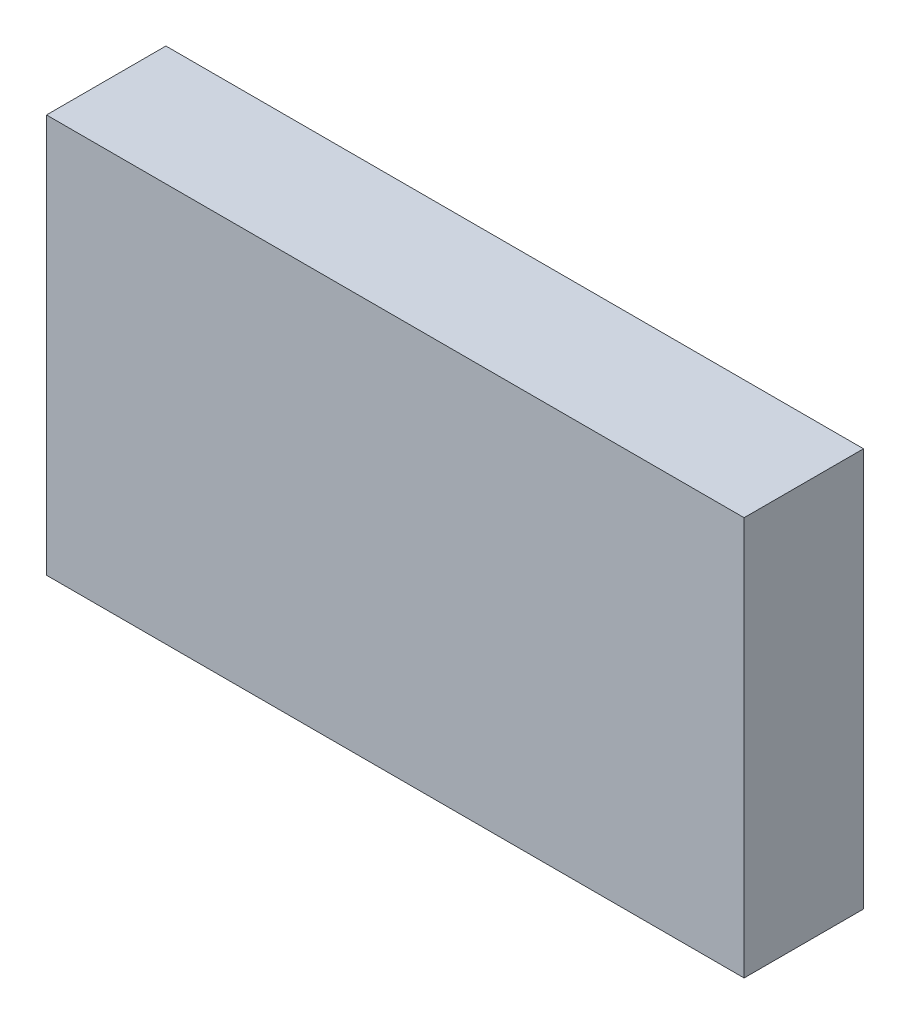
ISO-10303-21;
HEADER;
FILE_DESCRIPTION(('STEP AP214'),'2;1');
FILE_NAME('part.step','',(''),(''),'','','');
FILE_SCHEMA(('AUTOMOTIVE_DESIGN { 1 0 10303 214 1 1 1 1 }'));
ENDSEC;
DATA;
#1=APPLICATION_CONTEXT('core data for automotive mechanical design processes');
#2=APPLICATION_PROTOCOL_DEFINITION('international standard','automotive_design',2000,#1);
#3=PRODUCT_CONTEXT('',#1,'mechanical');
#4=PRODUCT('Part','Part','',(#3));
#5=PRODUCT_RELATED_PRODUCT_CATEGORY('part','',(#4));
#6=PRODUCT_DEFINITION_FORMATION('','',#4);
#7=PRODUCT_DEFINITION_CONTEXT('part definition',#1,'design');
#8=PRODUCT_DEFINITION('design','',#6,#7);
#9=PRODUCT_DEFINITION_SHAPE('','',#8);
#10=(LENGTH_UNIT() NAMED_UNIT(*) SI_UNIT(.MILLI.,.METRE.));
#11=(NAMED_UNIT(*) PLANE_ANGLE_UNIT() SI_UNIT($,.RADIAN.));
#12=(NAMED_UNIT(*) SI_UNIT($,.STERADIAN.) SOLID_ANGLE_UNIT());
#13=UNCERTAINTY_MEASURE_WITH_UNIT(LENGTH_MEASURE(1.E-05),#10,'distance_accuracy_value','');
#14=(GEOMETRIC_REPRESENTATION_CONTEXT(3) GLOBAL_UNCERTAINTY_ASSIGNED_CONTEXT((#13)) GLOBAL_UNIT_ASSIGNED_CONTEXT((#10,
#11,#12)) REPRESENTATION_CONTEXT('',''));
#15=CARTESIAN_POINT('',(0.,0.,0.));
#16=DIRECTION('',(0.,0.,1.));
#17=DIRECTION('',(1.,0.,0.));
#18=AXIS2_PLACEMENT_3D('',#15,#16,#17);
#19=CARTESIAN_POINT('',(29.2109060402685,-16.6919463087248,10.));
#20=DIRECTION('',(-1.,0.,0.));
#21=DIRECTION('',(0.,0.,1.));
#22=AXIS2_PLACEMENT_3D('',#19,#20,#21);
#23=PLANE('',#22);
#24=DIRECTION('',(0.,1.,0.));
#25=VECTOR('',#24,1.);
#26=CARTESIAN_POINT('',(29.2109060402685,-16.6919463087248,0.));
#27=LINE('',#26,#25);
#28=CARTESIAN_POINT('',(29.2109060402685,-16.6919463087248,0.));
#29=VERTEX_POINT('',#28);
#30=CARTESIAN_POINT('',(29.2109060402685,16.6919463087248,0.));
#31=VERTEX_POINT('',#30);
#32=EDGE_CURVE('E100',#29,#31,#27,.T.);
#33=ORIENTED_EDGE('',*,*,#32,.T.);
#34=DIRECTION('',(0.,0.,-1.));
#35=VECTOR('',#34,1.);
#36=CARTESIAN_POINT('',(29.2109060402685,16.6919463087248,10.));
#37=LINE('',#36,#35);
#38=CARTESIAN_POINT('',(29.2109060402685,16.6919463087248,10.));
#39=VERTEX_POINT('',#38);
#40=EDGE_CURVE('E11',#39,#31,#37,.T.);
#41=ORIENTED_EDGE('',*,*,#40,.F.);
#42=DIRECTION('',(0.,1.,0.));
#43=VECTOR('',#42,1.);
#44=CARTESIAN_POINT('',(29.2109060402685,-16.6919463087248,10.));
#45=LINE('',#44,#43);
#46=CARTESIAN_POINT('',(29.2109060402685,-16.6919463087248,10.));
#47=VERTEX_POINT('',#46);
#48=EDGE_CURVE('E88',#47,#39,#45,.T.);
#49=ORIENTED_EDGE('',*,*,#48,.F.);
#50=DIRECTION('',(0.,0.,-1.));
#51=VECTOR('',#50,1.);
#52=CARTESIAN_POINT('',(29.2109060402685,-16.6919463087248,10.));
#53=LINE('',#52,#51);
#54=EDGE_CURVE('E96',#47,#29,#53,.T.);
#55=ORIENTED_EDGE('',*,*,#54,.T.);
#56=EDGE_LOOP('',(#33,#41,#49,#55));
#57=FACE_BOUND('',#56,.T.);
#58=ADVANCED_FACE('F37',(#57),#23,.F.);
#59=CARTESIAN_POINT('',(29.2109060402685,16.6919463087248,10.));
#60=DIRECTION('',(0.,-1.,0.));
#61=DIRECTION('',(0.,0.,-1.));
#62=AXIS2_PLACEMENT_3D('',#59,#60,#61);
#63=PLANE('',#62);
#64=DIRECTION('',(-1.,0.,0.));
#65=VECTOR('',#64,1.);
#66=CARTESIAN_POINT('',(29.2109060402685,16.6919463087248,0.));
#67=LINE('',#66,#65);
#68=CARTESIAN_POINT('',(-29.2109060402685,16.6919463087248,0.));
#69=VERTEX_POINT('',#68);
#70=EDGE_CURVE('E92',#31,#69,#67,.T.);
#71=ORIENTED_EDGE('',*,*,#70,.T.);
#72=DIRECTION('',(0.,0.,-1.));
#73=VECTOR('',#72,1.);
#74=CARTESIAN_POINT('',(-29.2109060402685,16.6919463087248,10.));
#75=LINE('',#74,#73);
#76=CARTESIAN_POINT('',(-29.2109060402685,16.6919463087248,10.));
#77=VERTEX_POINT('',#76);
#78=EDGE_CURVE('E45',#77,#69,#75,.T.);
#79=ORIENTED_EDGE('',*,*,#78,.F.);
#80=DIRECTION('',(-1.,0.,0.));
#81=VECTOR('',#80,1.);
#82=CARTESIAN_POINT('',(29.2109060402685,16.6919463087248,10.));
#83=LINE('',#82,#81);
#84=EDGE_CURVE('E83',#39,#77,#83,.T.);
#85=ORIENTED_EDGE('',*,*,#84,.F.);
#86=ORIENTED_EDGE('',*,*,#40,.T.);
#87=EDGE_LOOP('',(#71,#79,#85,#86));
#88=FACE_BOUND('',#87,.T.);
#89=ADVANCED_FACE('F91',(#88),#63,.F.);
#90=CARTESIAN_POINT('',(-29.2109060402685,-16.6919463087248,10.));
#91=DIRECTION('',(1.,0.,0.));
#92=DIRECTION('',(0.,0.,-1.));
#93=AXIS2_PLACEMENT_3D('',#90,#91,#92);
#94=PLANE('',#93);
#95=DIRECTION('',(0.,-1.,0.));
#96=VECTOR('',#95,1.);
#97=CARTESIAN_POINT('',(-29.2109060402685,-16.6919463087248,0.));
#98=LINE('',#97,#96);
#99=CARTESIAN_POINT('',(-29.2109060402685,-16.6919463087248,0.));
#100=VERTEX_POINT('',#99);
#101=EDGE_CURVE('E70',#69,#100,#98,.T.);
#102=ORIENTED_EDGE('',*,*,#101,.T.);
#103=DIRECTION('',(0.,0.,-1.));
#104=VECTOR('',#103,1.);
#105=CARTESIAN_POINT('',(-29.2109060402685,-16.6919463087248,10.));
#106=LINE('',#105,#104);
#107=CARTESIAN_POINT('',(-29.2109060402685,-16.6919463087248,10.));
#108=VERTEX_POINT('',#107);
#109=EDGE_CURVE('E93',#108,#100,#106,.T.);
#110=ORIENTED_EDGE('',*,*,#109,.F.);
#111=DIRECTION('',(0.,-1.,0.));
#112=VECTOR('',#111,1.);
#113=CARTESIAN_POINT('',(-29.2109060402685,-16.6919463087248,10.));
#114=LINE('',#113,#112);
#115=EDGE_CURVE('E86',#77,#108,#114,.T.);
#116=ORIENTED_EDGE('',*,*,#115,.F.);
#117=ORIENTED_EDGE('',*,*,#78,.T.);
#118=EDGE_LOOP('',(#102,#110,#116,#117));
#119=FACE_BOUND('',#118,.T.);
#120=ADVANCED_FACE('F94',(#119),#94,.F.);
#121=CARTESIAN_POINT('',(29.2109060402685,-16.6919463087248,10.));
#122=DIRECTION('',(0.,1.,0.));
#123=DIRECTION('',(0.,0.,1.));
#124=AXIS2_PLACEMENT_3D('',#121,#122,#123);
#125=PLANE('',#124);
#126=DIRECTION('',(1.,0.,0.));
#127=VECTOR('',#126,1.);
#128=CARTESIAN_POINT('',(29.2109060402685,-16.6919463087248,0.));
#129=LINE('',#128,#127);
#130=EDGE_CURVE('E76',#100,#29,#129,.T.);
#131=ORIENTED_EDGE('',*,*,#130,.T.);
#132=ORIENTED_EDGE('',*,*,#54,.F.);
#133=DIRECTION('',(1.,0.,0.));
#134=VECTOR('',#133,1.);
#135=CARTESIAN_POINT('',(29.2109060402685,-16.6919463087248,10.));
#136=LINE('',#135,#134);
#137=EDGE_CURVE('E53',#108,#47,#136,.T.);
#138=ORIENTED_EDGE('',*,*,#137,.F.);
#139=ORIENTED_EDGE('',*,*,#109,.T.);
#140=EDGE_LOOP('',(#131,#132,#138,#139));
#141=FACE_BOUND('',#140,.T.);
#142=ADVANCED_FACE('F107',(#141),#125,.F.);
#143=CARTESIAN_POINT('',(0.,0.,10.));
#144=DIRECTION('',(0.,0.,1.));
#145=DIRECTION('',(1.,0.,0.));
#146=AXIS2_PLACEMENT_3D('',#143,#144,#145);
#147=PLANE('',#146);
#148=ORIENTED_EDGE('',*,*,#48,.T.);
#149=ORIENTED_EDGE('',*,*,#84,.T.);
#150=ORIENTED_EDGE('',*,*,#115,.T.);
#151=ORIENTED_EDGE('',*,*,#137,.T.);
#152=EDGE_LOOP('',(#148,#149,#150,#151));
#153=FACE_BOUND('',#152,.T.);
#154=ADVANCED_FACE('F84',(#153),#147,.T.);
#155=CARTESIAN_POINT('',(0.,0.,0.));
#156=DIRECTION('',(0.,0.,1.));
#157=DIRECTION('',(1.,0.,0.));
#158=AXIS2_PLACEMENT_3D('',#155,#156,#157);
#159=PLANE('',#158);
#160=ORIENTED_EDGE('',*,*,#32,.F.);
#161=ORIENTED_EDGE('',*,*,#130,.F.);
#162=ORIENTED_EDGE('',*,*,#101,.F.);
#163=ORIENTED_EDGE('',*,*,#70,.F.);
#164=EDGE_LOOP('',(#160,#161,#162,#163));
#165=FACE_BOUND('',#164,.T.);
#166=ADVANCED_FACE('F110',(#165),#159,.F.);
#167=CLOSED_SHELL('',(#58,#89,#120,#142,#154,#166));
#168=MANIFOLD_SOLID_BREP('B2',#167);
#169=ADVANCED_BREP_SHAPE_REPRESENTATION('',(#18,#168),#14);
#170=SHAPE_DEFINITION_REPRESENTATION(#9,#169);
ENDSEC;
END-ISO-10303-21;
